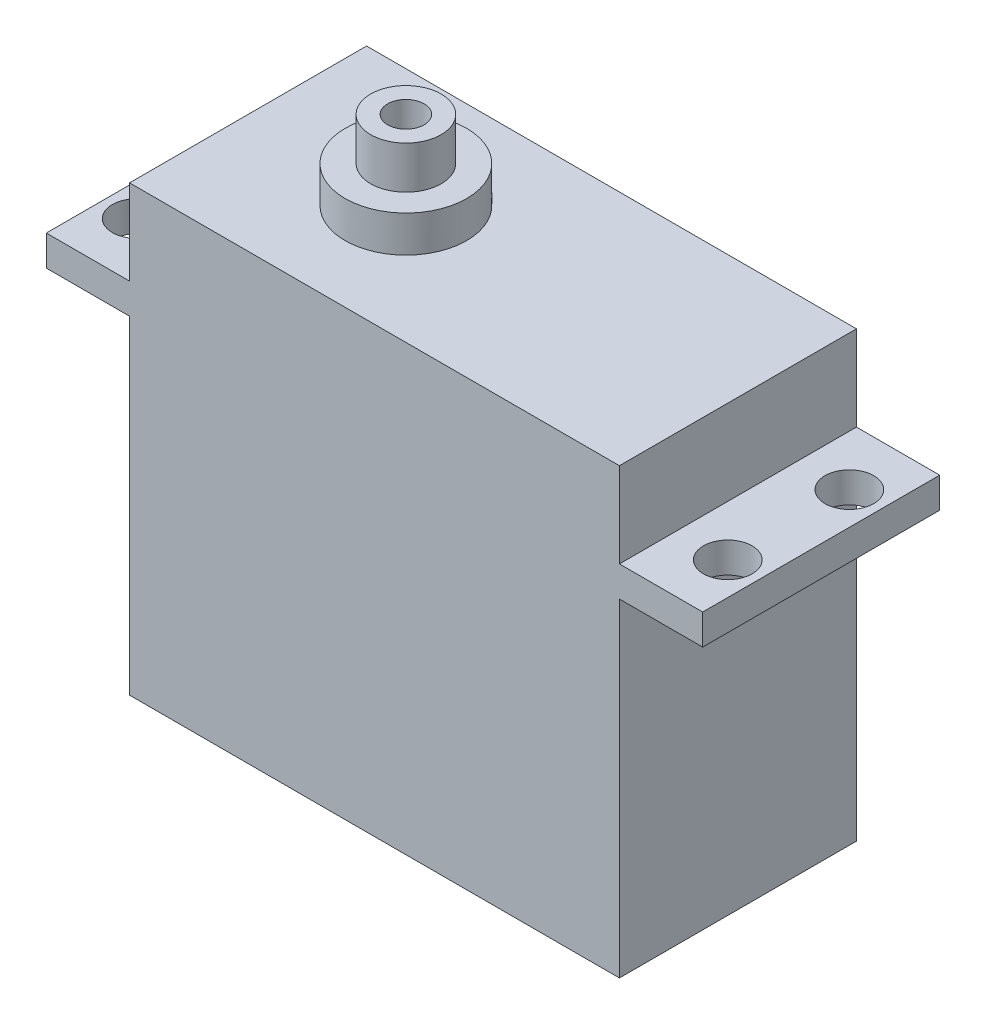
ISO-10303-21;
HEADER;
FILE_DESCRIPTION(('STEP AP214'),'2;1');
FILE_NAME('part.step','',(''),(''),'','','');
FILE_SCHEMA(('AUTOMOTIVE_DESIGN { 1 0 10303 214 1 1 1 1 }'));
ENDSEC;
DATA;
#1=APPLICATION_CONTEXT('core data for automotive mechanical design processes');
#2=APPLICATION_PROTOCOL_DEFINITION('international standard','automotive_design',2000,#1);
#3=PRODUCT_CONTEXT('',#1,'mechanical');
#4=PRODUCT('Part','Part','',(#3));
#5=PRODUCT_RELATED_PRODUCT_CATEGORY('part','',(#4));
#6=PRODUCT_DEFINITION_FORMATION('','',#4);
#7=PRODUCT_DEFINITION_CONTEXT('part definition',#1,'design');
#8=PRODUCT_DEFINITION('design','',#6,#7);
#9=PRODUCT_DEFINITION_SHAPE('','',#8);
#10=(LENGTH_UNIT() NAMED_UNIT(*) SI_UNIT(.MILLI.,.METRE.));
#11=(NAMED_UNIT(*) PLANE_ANGLE_UNIT() SI_UNIT($,.RADIAN.));
#12=(NAMED_UNIT(*) SI_UNIT($,.STERADIAN.) SOLID_ANGLE_UNIT());
#13=UNCERTAINTY_MEASURE_WITH_UNIT(LENGTH_MEASURE(1.E-05),#10,'distance_accuracy_value','');
#14=(GEOMETRIC_REPRESENTATION_CONTEXT(3) GLOBAL_UNCERTAINTY_ASSIGNED_CONTEXT((#13)) GLOBAL_UNIT_ASSIGNED_CONTEXT((#10,
#11,#12)) REPRESENTATION_CONTEXT('',''));
#15=CARTESIAN_POINT('',(0.,0.,0.));
#16=DIRECTION('',(0.,0.,1.));
#17=DIRECTION('',(1.,0.,0.));
#18=AXIS2_PLACEMENT_3D('',#15,#16,#17);
#19=CARTESIAN_POINT('',(-20.15,27.,9.75));
#20=DIRECTION('',(1.,0.,0.));
#21=DIRECTION('',(0.,0.,-1.));
#22=AXIS2_PLACEMENT_3D('',#19,#20,#21);
#23=PLANE('',#22);
#24=DIRECTION('',(0.,0.,1.));
#25=VECTOR('',#24,1.);
#26=CARTESIAN_POINT('',(-20.15,0.,9.75));
#27=LINE('',#26,#25);
#28=CARTESIAN_POINT('',(-20.15,0.,-9.75));
#29=VERTEX_POINT('',#28);
#30=CARTESIAN_POINT('',(-20.15,0.,9.75));
#31=VERTEX_POINT('',#30);
#32=EDGE_CURVE('E297',#29,#31,#27,.T.);
#33=ORIENTED_EDGE('',*,*,#32,.T.);
#34=DIRECTION('',(0.,-1.,0.));
#35=VECTOR('',#34,1.);
#36=CARTESIAN_POINT('',(-20.15,27.,9.75));
#37=LINE('',#36,#35);
#38=CARTESIAN_POINT('',(-20.15,27.,9.75));
#39=VERTEX_POINT('',#38);
#40=EDGE_CURVE('E302',#39,#31,#37,.T.);
#41=ORIENTED_EDGE('',*,*,#40,.F.);
#42=DIRECTION('',(0.,0.,1.));
#43=VECTOR('',#42,1.);
#44=CARTESIAN_POINT('',(-20.15,27.,9.75));
#45=LINE('',#44,#43);
#46=CARTESIAN_POINT('',(-20.15,27.,-9.75));
#47=VERTEX_POINT('',#46);
#48=EDGE_CURVE('E288',#47,#39,#45,.T.);
#49=ORIENTED_EDGE('',*,*,#48,.F.);
#50=DIRECTION('',(0.,-1.,0.));
#51=VECTOR('',#50,1.);
#52=CARTESIAN_POINT('',(-20.15,27.,-9.75));
#53=LINE('',#52,#51);
#54=EDGE_CURVE('E305',#47,#29,#53,.T.);
#55=ORIENTED_EDGE('',*,*,#54,.T.);
#56=EDGE_LOOP('',(#33,#41,#49,#55));
#57=FACE_BOUND('',#56,.T.);
#58=DIRECTION('',(0.,1.,0.));
#59=VECTOR('',#58,1.);
#60=CARTESIAN_POINT('',(-20.15,1.91574050567464,3.49494019914812));
#61=LINE('',#60,#59);
#62=CARTESIAN_POINT('',(-20.15,1.91574050567464,3.49494019914812));
#63=VERTEX_POINT('',#62);
#64=CARTESIAN_POINT('',(-20.15,5.06433527968195,3.49494019914812));
#65=VERTEX_POINT('',#64);
#66=EDGE_CURVE('E176',#63,#65,#61,.T.);
#67=ORIENTED_EDGE('',*,*,#66,.F.);
#68=DIRECTION('',(0.,0.,1.));
#69=VECTOR('',#68,1.);
#70=CARTESIAN_POINT('',(-20.15,1.91574050567464,-3.49494019914812));
#71=LINE('',#70,#69);
#72=CARTESIAN_POINT('',(-20.15,1.91574050567464,-3.49494019914812));
#73=VERTEX_POINT('',#72);
#74=EDGE_CURVE('E173',#73,#63,#71,.T.);
#75=ORIENTED_EDGE('',*,*,#74,.F.);
#76=DIRECTION('',(0.,-1.,0.));
#77=VECTOR('',#76,1.);
#78=CARTESIAN_POINT('',(-20.15,1.91574050567464,-3.49494019914812));
#79=LINE('',#78,#77);
#80=CARTESIAN_POINT('',(-20.15,5.06433527968195,-3.49494019914812));
#81=VERTEX_POINT('',#80);
#82=EDGE_CURVE('E63',#81,#73,#79,.T.);
#83=ORIENTED_EDGE('',*,*,#82,.F.);
#84=DIRECTION('',(0.,0.,-1.));
#85=VECTOR('',#84,1.);
#86=CARTESIAN_POINT('',(-20.15,5.06433527968195,-3.49494019914812));
#87=LINE('',#86,#85);
#88=EDGE_CURVE('E58',#65,#81,#87,.T.);
#89=ORIENTED_EDGE('',*,*,#88,.F.);
#90=EDGE_LOOP('',(#67,#75,#83,#89));
#91=FACE_BOUND('',#90,.T.);
#92=ADVANCED_FACE('F43',(#57,#91),#23,.F.);
#93=CARTESIAN_POINT('',(0.,36.5,0.));
#94=DIRECTION('',(0.,-1.,0.));
#95=DIRECTION('',(0.,0.,-1.));
#96=AXIS2_PLACEMENT_3D('',#93,#94,#95);
#97=PLANE('',#96);
#98=DIRECTION('',(0.,0.,-1.));
#99=VECTOR('',#98,1.);
#100=CARTESIAN_POINT('',(20.15,36.5,9.75));
#101=LINE('',#100,#99);
#102=CARTESIAN_POINT('',(20.15,36.5,9.75));
#103=VERTEX_POINT('',#102);
#104=CARTESIAN_POINT('',(20.15,36.5,-9.75));
#105=VERTEX_POINT('',#104);
#106=EDGE_CURVE('E198',#103,#105,#101,.T.);
#107=ORIENTED_EDGE('',*,*,#106,.T.);
#108=DIRECTION('',(-1.,0.,0.));
#109=VECTOR('',#108,1.);
#110=CARTESIAN_POINT('',(-20.15,36.5,-9.75));
#111=LINE('',#110,#109);
#112=CARTESIAN_POINT('',(-20.15,36.5,-9.75));
#113=VERTEX_POINT('',#112);
#114=EDGE_CURVE('E201',#105,#113,#111,.T.);
#115=ORIENTED_EDGE('',*,*,#114,.T.);
#116=DIRECTION('',(0.,0.,1.));
#117=VECTOR('',#116,1.);
#118=CARTESIAN_POINT('',(-20.15,36.5,9.75));
#119=LINE('',#118,#117);
#120=CARTESIAN_POINT('',(-20.15,36.5,9.75));
#121=VERTEX_POINT('',#120);
#122=EDGE_CURVE('E204',#113,#121,#119,.T.);
#123=ORIENTED_EDGE('',*,*,#122,.T.);
#124=DIRECTION('',(1.,0.,0.));
#125=VECTOR('',#124,1.);
#126=CARTESIAN_POINT('',(-20.15,36.5,9.75));
#127=LINE('',#126,#125);
#128=EDGE_CURVE('E206',#121,#103,#127,.T.);
#129=ORIENTED_EDGE('',*,*,#128,.T.);
#130=EDGE_LOOP('',(#107,#115,#123,#129));
#131=FACE_BOUND('',#130,.T.);
#132=CARTESIAN_POINT('',(-7.165,36.5,0.));
#133=DIRECTION('',(0.,-1.,0.));
#134=DIRECTION('',(0.,0.,-1.));
#135=AXIS2_PLACEMENT_3D('',#132,#133,#134);
#136=CIRCLE('',#135,5.);
#137=CARTESIAN_POINT('',(-7.165,36.5,-5.));
#138=VERTEX_POINT('',#137);
#139=EDGE_CURVE('E11',#138,#138,#136,.F.);
#140=ORIENTED_EDGE('',*,*,#139,.F.);
#141=EDGE_LOOP('',(#140));
#142=FACE_BOUND('',#141,.T.);
#143=ADVANCED_FACE('F342',(#131,#142),#97,.F.);
#144=CARTESIAN_POINT('',(0.,29.5,0.));
#145=DIRECTION('',(0.,-1.,0.));
#146=DIRECTION('',(0.,0.,-1.));
#147=AXIS2_PLACEMENT_3D('',#144,#145,#146);
#148=PLANE('',#147);
#149=CARTESIAN_POINT('',(24.315,29.5,-5.));
#150=DIRECTION('',(0.,1.,0.));
#151=DIRECTION('',(0.,0.,1.));
#152=AXIS2_PLACEMENT_3D('',#149,#150,#151);
#153=CIRCLE('',#152,2.);
#154=CARTESIAN_POINT('',(24.315,29.5,-3.));
#155=VERTEX_POINT('',#154);
#156=EDGE_CURVE('E243',#155,#155,#153,.T.);
#157=ORIENTED_EDGE('',*,*,#156,.F.);
#158=EDGE_LOOP('',(#157));
#159=FACE_BOUND('',#158,.T.);
#160=CARTESIAN_POINT('',(24.315,29.5,5.));
#161=DIRECTION('',(0.,1.,0.));
#162=DIRECTION('',(0.,0.,-1.));
#163=AXIS2_PLACEMENT_3D('',#160,#161,#162);
#164=CIRCLE('',#163,2.);
#165=CARTESIAN_POINT('',(24.315,29.5,3.));
#166=VERTEX_POINT('',#165);
#167=EDGE_CURVE('E238',#166,#166,#164,.T.);
#168=ORIENTED_EDGE('',*,*,#167,.F.);
#169=EDGE_LOOP('',(#168));
#170=FACE_BOUND('',#169,.T.);
#171=DIRECTION('',(0.,0.,-1.));
#172=VECTOR('',#171,1.);
#173=CARTESIAN_POINT('',(20.15,29.5,9.75));
#174=LINE('',#173,#172);
#175=CARTESIAN_POINT('',(20.15,29.5,9.75));
#176=VERTEX_POINT('',#175);
#177=CARTESIAN_POINT('',(20.15,29.5,-9.75));
#178=VERTEX_POINT('',#177);
#179=EDGE_CURVE('E197',#176,#178,#174,.T.);
#180=ORIENTED_EDGE('',*,*,#179,.F.);
#181=DIRECTION('',(1.,0.,0.));
#182=VECTOR('',#181,1.);
#183=CARTESIAN_POINT('',(-27.,29.5,9.75));
#184=LINE('',#183,#182);
#185=CARTESIAN_POINT('',(27.,29.5,9.75));
#186=VERTEX_POINT('',#185);
#187=EDGE_CURVE('E258',#176,#186,#184,.T.);
#188=ORIENTED_EDGE('',*,*,#187,.T.);
#189=DIRECTION('',(0.,0.,-1.));
#190=VECTOR('',#189,1.);
#191=CARTESIAN_POINT('',(27.,29.5,9.75));
#192=LINE('',#191,#190);
#193=CARTESIAN_POINT('',(27.,29.5,-9.75));
#194=VERTEX_POINT('',#193);
#195=EDGE_CURVE('E249',#186,#194,#192,.T.);
#196=ORIENTED_EDGE('',*,*,#195,.T.);
#197=DIRECTION('',(-1.,0.,0.));
#198=VECTOR('',#197,1.);
#199=CARTESIAN_POINT('',(-27.,29.5,-9.75));
#200=LINE('',#199,#198);
#201=EDGE_CURVE('E254',#194,#178,#200,.T.);
#202=ORIENTED_EDGE('',*,*,#201,.T.);
#203=EDGE_LOOP('',(#180,#188,#196,#202));
#204=FACE_BOUND('',#203,.T.);
#205=ADVANCED_FACE('F351',(#159,#170,#204),#148,.F.);
#206=CARTESIAN_POINT('',(-24.315,29.5,5.));
#207=DIRECTION('',(0.,1.,0.));
#208=DIRECTION('',(0.,0.,1.));
#209=AXIS2_PLACEMENT_3D('',#206,#207,#208);
#210=CIRCLE('',#209,2.);
#211=CARTESIAN_POINT('',(-24.315,29.5,7.));
#212=VERTEX_POINT('',#211);
#213=EDGE_CURVE('E225',#212,#212,#210,.T.);
#214=ORIENTED_EDGE('',*,*,#213,.F.);
#215=EDGE_LOOP('',(#214));
#216=FACE_BOUND('',#215,.T.);
#217=CARTESIAN_POINT('',(-24.315,29.5,-5.));
#218=DIRECTION('',(0.,1.,0.));
#219=DIRECTION('',(0.,0.,-1.));
#220=AXIS2_PLACEMENT_3D('',#217,#218,#219);
#221=CIRCLE('',#220,2.);
#222=CARTESIAN_POINT('',(-24.315,29.5,-7.));
#223=VERTEX_POINT('',#222);
#224=EDGE_CURVE('E231',#223,#223,#221,.T.);
#225=ORIENTED_EDGE('',*,*,#224,.F.);
#226=EDGE_LOOP('',(#225));
#227=FACE_BOUND('',#226,.T.);
#228=DIRECTION('',(0.,0.,1.));
#229=VECTOR('',#228,1.);
#230=CARTESIAN_POINT('',(-20.15,29.5,9.75));
#231=LINE('',#230,#229);
#232=CARTESIAN_POINT('',(-20.15,29.5,-9.75));
#233=VERTEX_POINT('',#232);
#234=CARTESIAN_POINT('',(-20.15,29.5,9.75));
#235=VERTEX_POINT('',#234);
#236=EDGE_CURVE('E202',#233,#235,#231,.T.);
#237=ORIENTED_EDGE('',*,*,#236,.F.);
#238=CARTESIAN_POINT('',(-27.,29.5,-9.75));
#239=VERTEX_POINT('',#238);
#240=EDGE_CURVE('E252',#233,#239,#200,.T.);
#241=ORIENTED_EDGE('',*,*,#240,.T.);
#242=DIRECTION('',(0.,0.,1.));
#243=VECTOR('',#242,1.);
#244=CARTESIAN_POINT('',(-27.,29.5,9.75));
#245=LINE('',#244,#243);
#246=CARTESIAN_POINT('',(-27.,29.5,9.75));
#247=VERTEX_POINT('',#246);
#248=EDGE_CURVE('E256',#239,#247,#245,.T.);
#249=ORIENTED_EDGE('',*,*,#248,.T.);
#250=EDGE_CURVE('E259',#247,#235,#184,.T.);
#251=ORIENTED_EDGE('',*,*,#250,.T.);
#252=EDGE_LOOP('',(#237,#241,#249,#251));
#253=FACE_BOUND('',#252,.T.);
#254=ADVANCED_FACE('F334',(#216,#227,#253),#148,.F.);
#255=CARTESIAN_POINT('',(20.15,27.,9.75));
#256=DIRECTION('',(-1.,0.,0.));
#257=DIRECTION('',(0.,0.,1.));
#258=AXIS2_PLACEMENT_3D('',#255,#256,#257);
#259=PLANE('',#258);
#260=DIRECTION('',(0.,0.,-1.));
#261=VECTOR('',#260,1.);
#262=CARTESIAN_POINT('',(20.15,0.,9.75));
#263=LINE('',#262,#261);
#264=CARTESIAN_POINT('',(20.15,0.,9.75));
#265=VERTEX_POINT('',#264);
#266=CARTESIAN_POINT('',(20.15,0.,-9.75));
#267=VERTEX_POINT('',#266);
#268=EDGE_CURVE('E284',#265,#267,#263,.T.);
#269=ORIENTED_EDGE('',*,*,#268,.T.);
#270=DIRECTION('',(0.,-1.,0.));
#271=VECTOR('',#270,1.);
#272=CARTESIAN_POINT('',(20.15,27.,-9.75));
#273=LINE('',#272,#271);
#274=CARTESIAN_POINT('',(20.15,27.,-9.75));
#275=VERTEX_POINT('',#274);
#276=EDGE_CURVE('E51',#275,#267,#273,.T.);
#277=ORIENTED_EDGE('',*,*,#276,.F.);
#278=DIRECTION('',(0.,0.,-1.));
#279=VECTOR('',#278,1.);
#280=CARTESIAN_POINT('',(20.15,27.,9.75));
#281=LINE('',#280,#279);
#282=CARTESIAN_POINT('',(20.15,27.,9.75));
#283=VERTEX_POINT('',#282);
#284=EDGE_CURVE('E285',#283,#275,#281,.T.);
#285=ORIENTED_EDGE('',*,*,#284,.F.);
#286=DIRECTION('',(0.,-1.,0.));
#287=VECTOR('',#286,1.);
#288=CARTESIAN_POINT('',(20.15,27.,9.75));
#289=LINE('',#288,#287);
#290=EDGE_CURVE('E292',#283,#265,#289,.T.);
#291=ORIENTED_EDGE('',*,*,#290,.T.);
#292=EDGE_LOOP('',(#269,#277,#285,#291));
#293=FACE_BOUND('',#292,.T.);
#294=ADVANCED_FACE('F45',(#293),#259,.F.);
#295=CARTESIAN_POINT('',(-20.15,27.,-9.75));
#296=DIRECTION('',(0.,0.,1.));
#297=DIRECTION('',(1.,0.,0.));
#298=AXIS2_PLACEMENT_3D('',#295,#296,#297);
#299=PLANE('',#298);
#300=DIRECTION('',(-1.,0.,0.));
#301=VECTOR('',#300,1.);
#302=CARTESIAN_POINT('',(-20.15,0.,-9.75));
#303=LINE('',#302,#301);
#304=EDGE_CURVE('E295',#267,#29,#303,.T.);
#305=ORIENTED_EDGE('',*,*,#304,.T.);
#306=ORIENTED_EDGE('',*,*,#54,.F.);
#307=DIRECTION('',(-1.,0.,0.));
#308=VECTOR('',#307,1.);
#309=CARTESIAN_POINT('',(-27.,27.,-9.75));
#310=LINE('',#309,#308);
#311=CARTESIAN_POINT('',(-27.,27.,-9.75));
#312=VERTEX_POINT('',#311);
#313=EDGE_CURVE('E264',#47,#312,#310,.T.);
#314=ORIENTED_EDGE('',*,*,#313,.T.);
#315=DIRECTION('',(0.,-1.,0.));
#316=VECTOR('',#315,1.);
#317=CARTESIAN_POINT('',(-27.,29.5,-9.75));
#318=LINE('',#317,#316);
#319=EDGE_CURVE('E278',#239,#312,#318,.T.);
#320=ORIENTED_EDGE('',*,*,#319,.F.);
#321=ORIENTED_EDGE('',*,*,#240,.F.);
#322=DIRECTION('',(0.,-1.,0.));
#323=VECTOR('',#322,1.);
#324=CARTESIAN_POINT('',(-20.15,36.5,-9.75));
#325=LINE('',#324,#323);
#326=EDGE_CURVE('E218',#113,#233,#325,.T.);
#327=ORIENTED_EDGE('',*,*,#326,.F.);
#328=ORIENTED_EDGE('',*,*,#114,.F.);
#329=DIRECTION('',(0.,-1.,0.));
#330=VECTOR('',#329,1.);
#331=CARTESIAN_POINT('',(20.15,36.5,-9.75));
#332=LINE('',#331,#330);
#333=EDGE_CURVE('E221',#105,#178,#332,.T.);
#334=ORIENTED_EDGE('',*,*,#333,.T.);
#335=ORIENTED_EDGE('',*,*,#201,.F.);
#336=DIRECTION('',(0.,-1.,0.));
#337=VECTOR('',#336,1.);
#338=CARTESIAN_POINT('',(27.,29.5,-9.75));
#339=LINE('',#338,#337);
#340=CARTESIAN_POINT('',(27.,27.,-9.75));
#341=VERTEX_POINT('',#340);
#342=EDGE_CURVE('E281',#194,#341,#339,.T.);
#343=ORIENTED_EDGE('',*,*,#342,.T.);
#344=EDGE_CURVE('E265',#341,#275,#310,.T.);
#345=ORIENTED_EDGE('',*,*,#344,.T.);
#346=ORIENTED_EDGE('',*,*,#276,.T.);
#347=EDGE_LOOP('',(#305,#306,#314,#320,#321,#327,#328,#334,#335,#343,#345,#346));
#348=FACE_BOUND('',#347,.T.);
#349=ADVANCED_FACE('F309',(#348),#299,.F.);
#350=CARTESIAN_POINT('',(-20.15,27.,9.75));
#351=DIRECTION('',(0.,0.,-1.));
#352=DIRECTION('',(-1.,0.,0.));
#353=AXIS2_PLACEMENT_3D('',#350,#351,#352);
#354=PLANE('',#353);
#355=DIRECTION('',(1.,0.,0.));
#356=VECTOR('',#355,1.);
#357=CARTESIAN_POINT('',(-20.15,0.,9.75));
#358=LINE('',#357,#356);
#359=EDGE_CURVE('E289',#31,#265,#358,.T.);
#360=ORIENTED_EDGE('',*,*,#359,.T.);
#361=ORIENTED_EDGE('',*,*,#290,.F.);
#362=DIRECTION('',(1.,0.,0.));
#363=VECTOR('',#362,1.);
#364=CARTESIAN_POINT('',(-27.,27.,9.75));
#365=LINE('',#364,#363);
#366=CARTESIAN_POINT('',(27.,27.,9.75));
#367=VERTEX_POINT('',#366);
#368=EDGE_CURVE('E270',#283,#367,#365,.T.);
#369=ORIENTED_EDGE('',*,*,#368,.T.);
#370=DIRECTION('',(0.,-1.,0.));
#371=VECTOR('',#370,1.);
#372=CARTESIAN_POINT('',(27.,29.5,9.75));
#373=LINE('',#372,#371);
#374=EDGE_CURVE('E261',#186,#367,#373,.T.);
#375=ORIENTED_EDGE('',*,*,#374,.F.);
#376=ORIENTED_EDGE('',*,*,#187,.F.);
#377=DIRECTION('',(0.,-1.,0.));
#378=VECTOR('',#377,1.);
#379=CARTESIAN_POINT('',(20.15,36.5,9.75));
#380=LINE('',#379,#378);
#381=EDGE_CURVE('E208',#103,#176,#380,.T.);
#382=ORIENTED_EDGE('',*,*,#381,.F.);
#383=ORIENTED_EDGE('',*,*,#128,.F.);
#384=DIRECTION('',(0.,-1.,0.));
#385=VECTOR('',#384,1.);
#386=CARTESIAN_POINT('',(-20.15,36.5,9.75));
#387=LINE('',#386,#385);
#388=EDGE_CURVE('E215',#121,#235,#387,.T.);
#389=ORIENTED_EDGE('',*,*,#388,.T.);
#390=ORIENTED_EDGE('',*,*,#250,.F.);
#391=DIRECTION('',(0.,-1.,0.));
#392=VECTOR('',#391,1.);
#393=CARTESIAN_POINT('',(-27.,29.5,9.75));
#394=LINE('',#393,#392);
#395=CARTESIAN_POINT('',(-27.,27.,9.75));
#396=VERTEX_POINT('',#395);
#397=EDGE_CURVE('E275',#247,#396,#394,.T.);
#398=ORIENTED_EDGE('',*,*,#397,.T.);
#399=EDGE_CURVE('E253',#396,#39,#365,.T.);
#400=ORIENTED_EDGE('',*,*,#399,.T.);
#401=ORIENTED_EDGE('',*,*,#40,.T.);
#402=EDGE_LOOP('',(#360,#361,#369,#375,#376,#382,#383,#389,#390,#398,#400,#401));
#403=FACE_BOUND('',#402,.T.);
#404=ADVANCED_FACE('F320',(#403),#354,.F.);
#405=CARTESIAN_POINT('',(0.,0.,0.));
#406=DIRECTION('',(0.,-1.,0.));
#407=DIRECTION('',(0.,0.,-1.));
#408=AXIS2_PLACEMENT_3D('',#405,#406,#407);
#409=PLANE('',#408);
#410=ORIENTED_EDGE('',*,*,#268,.F.);
#411=ORIENTED_EDGE('',*,*,#359,.F.);
#412=ORIENTED_EDGE('',*,*,#32,.F.);
#413=ORIENTED_EDGE('',*,*,#304,.F.);
#414=EDGE_LOOP('',(#410,#411,#412,#413));
#415=FACE_BOUND('',#414,.T.);
#416=ADVANCED_FACE('F315',(#415),#409,.T.);
#417=CARTESIAN_POINT('',(0.,27.,0.));
#418=DIRECTION('',(0.,-1.,0.));
#419=DIRECTION('',(0.,0.,-1.));
#420=AXIS2_PLACEMENT_3D('',#417,#418,#419);
#421=PLANE('',#420);
#422=CARTESIAN_POINT('',(24.315,27.,5.));
#423=DIRECTION('',(0.,-1.,0.));
#424=DIRECTION('',(0.,0.,-1.));
#425=AXIS2_PLACEMENT_3D('',#422,#423,#424);
#426=CIRCLE('',#425,2.);
#427=CARTESIAN_POINT('',(24.315,27.,3.));
#428=VERTEX_POINT('',#427);
#429=EDGE_CURVE('E228',#428,#428,#426,.F.);
#430=ORIENTED_EDGE('',*,*,#429,.T.);
#431=EDGE_LOOP('',(#430));
#432=FACE_BOUND('',#431,.T.);
#433=CARTESIAN_POINT('',(24.315,27.,-5.));
#434=DIRECTION('',(0.,-1.,0.));
#435=DIRECTION('',(0.,0.,-1.));
#436=AXIS2_PLACEMENT_3D('',#433,#434,#435);
#437=CIRCLE('',#436,2.);
#438=CARTESIAN_POINT('',(24.315,27.,-7.));
#439=VERTEX_POINT('',#438);
#440=EDGE_CURVE('E234',#439,#439,#437,.F.);
#441=ORIENTED_EDGE('',*,*,#440,.T.);
#442=EDGE_LOOP('',(#441));
#443=FACE_BOUND('',#442,.T.);
#444=ORIENTED_EDGE('',*,*,#368,.F.);
#445=ORIENTED_EDGE('',*,*,#284,.T.);
#446=ORIENTED_EDGE('',*,*,#344,.F.);
#447=DIRECTION('',(0.,0.,-1.));
#448=VECTOR('',#447,1.);
#449=CARTESIAN_POINT('',(27.,27.,9.75));
#450=LINE('',#449,#448);
#451=EDGE_CURVE('E246',#367,#341,#450,.T.);
#452=ORIENTED_EDGE('',*,*,#451,.F.);
#453=EDGE_LOOP('',(#444,#445,#446,#452));
#454=FACE_BOUND('',#453,.T.);
#455=ADVANCED_FACE('F360',(#432,#443,#454),#421,.T.);
#456=CARTESIAN_POINT('',(27.,29.5,9.75));
#457=DIRECTION('',(-1.,0.,0.));
#458=DIRECTION('',(0.,0.,1.));
#459=AXIS2_PLACEMENT_3D('',#456,#457,#458);
#460=PLANE('',#459);
#461=ORIENTED_EDGE('',*,*,#451,.T.);
#462=ORIENTED_EDGE('',*,*,#342,.F.);
#463=ORIENTED_EDGE('',*,*,#195,.F.);
#464=ORIENTED_EDGE('',*,*,#374,.T.);
#465=EDGE_LOOP('',(#461,#462,#463,#464));
#466=FACE_BOUND('',#465,.T.);
#467=ADVANCED_FACE('F358',(#466),#460,.F.);
#468=CARTESIAN_POINT('',(-27.,29.5,9.75));
#469=DIRECTION('',(1.,0.,0.));
#470=DIRECTION('',(0.,0.,-1.));
#471=AXIS2_PLACEMENT_3D('',#468,#469,#470);
#472=PLANE('',#471);
#473=DIRECTION('',(0.,0.,1.));
#474=VECTOR('',#473,1.);
#475=CARTESIAN_POINT('',(-27.,27.,9.75));
#476=LINE('',#475,#474);
#477=EDGE_CURVE('E268',#312,#396,#476,.T.);
#478=ORIENTED_EDGE('',*,*,#477,.T.);
#479=ORIENTED_EDGE('',*,*,#397,.F.);
#480=ORIENTED_EDGE('',*,*,#248,.F.);
#481=ORIENTED_EDGE('',*,*,#319,.T.);
#482=EDGE_LOOP('',(#478,#479,#480,#481));
#483=FACE_BOUND('',#482,.T.);
#484=ADVANCED_FACE('F332',(#483),#472,.F.);
#485=CARTESIAN_POINT('',(-24.315,27.,-5.));
#486=DIRECTION('',(0.,-1.,0.));
#487=DIRECTION('',(0.,0.,-1.));
#488=AXIS2_PLACEMENT_3D('',#485,#486,#487);
#489=CIRCLE('',#488,2.);
#490=CARTESIAN_POINT('',(-24.315,27.,-7.));
#491=VERTEX_POINT('',#490);
#492=EDGE_CURVE('E235',#491,#491,#489,.F.);
#493=ORIENTED_EDGE('',*,*,#492,.T.);
#494=EDGE_LOOP('',(#493));
#495=FACE_BOUND('',#494,.T.);
#496=CARTESIAN_POINT('',(-24.315,27.,5.));
#497=DIRECTION('',(0.,-1.,0.));
#498=DIRECTION('',(0.,0.,-1.));
#499=AXIS2_PLACEMENT_3D('',#496,#497,#498);
#500=CIRCLE('',#499,2.);
#501=CARTESIAN_POINT('',(-24.315,27.,3.));
#502=VERTEX_POINT('',#501);
#503=EDGE_CURVE('E224',#502,#502,#500,.F.);
#504=ORIENTED_EDGE('',*,*,#503,.T.);
#505=EDGE_LOOP('',(#504));
#506=FACE_BOUND('',#505,.T.);
#507=ORIENTED_EDGE('',*,*,#313,.F.);
#508=ORIENTED_EDGE('',*,*,#48,.T.);
#509=ORIENTED_EDGE('',*,*,#399,.F.);
#510=ORIENTED_EDGE('',*,*,#477,.F.);
#511=EDGE_LOOP('',(#507,#508,#509,#510));
#512=FACE_BOUND('',#511,.T.);
#513=ADVANCED_FACE('F327',(#495,#506,#512),#421,.T.);
#514=CARTESIAN_POINT('',(-24.315,-0.001000000000001,5.));
#515=DIRECTION('',(0.,1.,0.));
#516=DIRECTION('',(0.,0.,1.));
#517=AXIS2_PLACEMENT_3D('',#514,#515,#516);
#518=CYLINDRICAL_SURFACE('',#517,2.);
#519=ORIENTED_EDGE('',*,*,#503,.F.);
#520=EDGE_LOOP('',(#519));
#521=FACE_BOUND('',#520,.T.);
#522=ORIENTED_EDGE('',*,*,#213,.T.);
#523=EDGE_LOOP('',(#522));
#524=FACE_BOUND('',#523,.T.);
#525=ADVANCED_FACE('F375',(#521,#524),#518,.F.);
#526=CARTESIAN_POINT('',(-24.315,-0.001000000000001,-5.));
#527=DIRECTION('',(0.,1.,0.));
#528=DIRECTION('',(0.,0.,1.));
#529=AXIS2_PLACEMENT_3D('',#526,#527,#528);
#530=CYLINDRICAL_SURFACE('',#529,2.);
#531=ORIENTED_EDGE('',*,*,#492,.F.);
#532=EDGE_LOOP('',(#531));
#533=FACE_BOUND('',#532,.T.);
#534=ORIENTED_EDGE('',*,*,#224,.T.);
#535=EDGE_LOOP('',(#534));
#536=FACE_BOUND('',#535,.T.);
#537=ADVANCED_FACE('F407',(#533,#536),#530,.F.);
#538=CARTESIAN_POINT('',(24.315,-0.001000000000001,-5.));
#539=DIRECTION('',(0.,1.,0.));
#540=DIRECTION('',(0.,0.,1.));
#541=AXIS2_PLACEMENT_3D('',#538,#539,#540);
#542=CYLINDRICAL_SURFACE('',#541,2.);
#543=ORIENTED_EDGE('',*,*,#440,.F.);
#544=EDGE_LOOP('',(#543));
#545=FACE_BOUND('',#544,.T.);
#546=ORIENTED_EDGE('',*,*,#156,.T.);
#547=EDGE_LOOP('',(#546));
#548=FACE_BOUND('',#547,.T.);
#549=ADVANCED_FACE('F403',(#545,#548),#542,.F.);
#550=CARTESIAN_POINT('',(24.315,-0.001000000000001,5.));
#551=DIRECTION('',(0.,1.,0.));
#552=DIRECTION('',(0.,0.,1.));
#553=AXIS2_PLACEMENT_3D('',#550,#551,#552);
#554=CYLINDRICAL_SURFACE('',#553,2.);
#555=ORIENTED_EDGE('',*,*,#429,.F.);
#556=EDGE_LOOP('',(#555));
#557=FACE_BOUND('',#556,.T.);
#558=ORIENTED_EDGE('',*,*,#167,.T.);
#559=EDGE_LOOP('',(#558));
#560=FACE_BOUND('',#559,.T.);
#561=ADVANCED_FACE('F406',(#557,#560),#554,.F.);
#562=CARTESIAN_POINT('',(20.15,36.5,9.75));
#563=DIRECTION('',(-1.,0.,0.));
#564=DIRECTION('',(0.,0.,1.));
#565=AXIS2_PLACEMENT_3D('',#562,#563,#564);
#566=PLANE('',#565);
#567=ORIENTED_EDGE('',*,*,#179,.T.);
#568=ORIENTED_EDGE('',*,*,#333,.F.);
#569=ORIENTED_EDGE('',*,*,#106,.F.);
#570=ORIENTED_EDGE('',*,*,#381,.T.);
#571=EDGE_LOOP('',(#567,#568,#569,#570));
#572=FACE_BOUND('',#571,.T.);
#573=ADVANCED_FACE('F348',(#572),#566,.F.);
#574=CARTESIAN_POINT('',(-20.15,36.5,9.75));
#575=DIRECTION('',(1.,0.,0.));
#576=DIRECTION('',(0.,0.,-1.));
#577=AXIS2_PLACEMENT_3D('',#574,#575,#576);
#578=PLANE('',#577);
#579=ORIENTED_EDGE('',*,*,#236,.T.);
#580=ORIENTED_EDGE('',*,*,#388,.F.);
#581=ORIENTED_EDGE('',*,*,#122,.F.);
#582=ORIENTED_EDGE('',*,*,#326,.T.);
#583=EDGE_LOOP('',(#579,#580,#581,#582));
#584=FACE_BOUND('',#583,.T.);
#585=ADVANCED_FACE('F338',(#584),#578,.F.);
#586=CARTESIAN_POINT('',(-7.165,39.5,0.));
#587=DIRECTION('',(0.,1.,0.));
#588=DIRECTION('',(0.,0.,1.));
#589=AXIS2_PLACEMENT_3D('',#586,#587,#588);
#590=PLANE('',#589);
#591=CARTESIAN_POINT('',(-7.165,39.5,0.));
#592=DIRECTION('',(0.,1.,0.));
#593=DIRECTION('',(0.,0.,1.));
#594=AXIS2_PLACEMENT_3D('',#591,#592,#593);
#595=CIRCLE('',#594,5.);
#596=CARTESIAN_POINT('',(-7.165,39.5,5.));
#597=VERTEX_POINT('',#596);
#598=EDGE_CURVE('E180',#597,#597,#595,.T.);
#599=ORIENTED_EDGE('',*,*,#598,.T.);
#600=EDGE_LOOP('',(#599));
#601=FACE_BOUND('',#600,.T.);
#602=CARTESIAN_POINT('',(-7.165,39.5,0.));
#603=DIRECTION('',(0.,1.,0.));
#604=DIRECTION('',(0.,0.,1.));
#605=AXIS2_PLACEMENT_3D('',#602,#603,#604);
#606=CIRCLE('',#605,2.9);
#607=CARTESIAN_POINT('',(-7.165,39.5,-2.9));
#608=VERTEX_POINT('',#607);
#609=EDGE_CURVE('E177',#608,#608,#606,.T.);
#610=ORIENTED_EDGE('',*,*,#609,.F.);
#611=EDGE_LOOP('',(#610));
#612=FACE_BOUND('',#611,.T.);
#613=ADVANCED_FACE('F421',(#601,#612),#590,.T.);
#614=CARTESIAN_POINT('',(-7.165,39.5,0.));
#615=DIRECTION('',(0.,-1.,0.));
#616=DIRECTION('',(0.,0.,-1.));
#617=AXIS2_PLACEMENT_3D('',#614,#615,#616);
#618=CYLINDRICAL_SURFACE('',#617,5.);
#619=ORIENTED_EDGE('',*,*,#598,.F.);
#620=EDGE_LOOP('',(#619));
#621=FACE_BOUND('',#620,.T.);
#622=ORIENTED_EDGE('',*,*,#139,.T.);
#623=EDGE_LOOP('',(#622));
#624=FACE_BOUND('',#623,.T.);
#625=ADVANCED_FACE('F434',(#621,#624),#618,.T.);
#626=CARTESIAN_POINT('',(-7.165,36.5,0.));
#627=DIRECTION('',(0.,1.,0.));
#628=DIRECTION('',(0.,0.,1.));
#629=AXIS2_PLACEMENT_3D('',#626,#627,#628);
#630=CIRCLE('',#629,1.5);
#631=CARTESIAN_POINT('',(-7.165,36.5,-1.5));
#632=VERTEX_POINT('',#631);
#633=EDGE_CURVE('E188',#632,#632,#630,.T.);
#634=ORIENTED_EDGE('',*,*,#633,.T.);
#635=EDGE_LOOP('',(#634));
#636=FACE_BOUND('',#635,.T.);
#637=ADVANCED_FACE('F385',(#636),#97,.F.);
#638=CARTESIAN_POINT('',(-7.165,43.,0.));
#639=DIRECTION('',(0.,-1.,0.));
#640=DIRECTION('',(0.,0.,-1.));
#641=AXIS2_PLACEMENT_3D('',#638,#639,#640);
#642=CYLINDRICAL_SURFACE('',#641,1.5);
#643=CARTESIAN_POINT('',(-7.165,43.,0.));
#644=DIRECTION('',(0.,1.,0.));
#645=DIRECTION('',(0.,0.,1.));
#646=AXIS2_PLACEMENT_3D('',#643,#644,#645);
#647=CIRCLE('',#646,1.5);
#648=CARTESIAN_POINT('',(-7.165,43.,-1.5));
#649=VERTEX_POINT('',#648);
#650=EDGE_CURVE('E189',#649,#649,#647,.T.);
#651=CARTESIAN_POINT('',(-7.165,43.,-1.5));
#652=CARTESIAN_POINT('',(-7.165,42.9322916666667,-1.5));
#653=CARTESIAN_POINT('',(-7.165,42.8645833333333,-1.5));
#654=CARTESIAN_POINT('',(-7.165,42.7291666666667,-1.5));
#655=CARTESIAN_POINT('',(-7.165,42.6614583333333,-1.5));
#656=CARTESIAN_POINT('',(-7.165,42.5260416666667,-1.5));
#657=CARTESIAN_POINT('',(-7.165,42.4583333333333,-1.5));
#658=CARTESIAN_POINT('',(-7.165,42.3229166666667,-1.5));
#659=CARTESIAN_POINT('',(-7.165,42.2552083333333,-1.5));
#660=CARTESIAN_POINT('',(-7.165,42.1197916666667,-1.5));
#661=CARTESIAN_POINT('',(-7.165,42.0520833333333,-1.5));
#662=CARTESIAN_POINT('',(-7.165,41.9166666666667,-1.5));
#663=CARTESIAN_POINT('',(-7.165,41.8489583333333,-1.5));
#664=CARTESIAN_POINT('',(-7.165,41.7135416666667,-1.5));
#665=CARTESIAN_POINT('',(-7.165,41.6458333333333,-1.5));
#666=CARTESIAN_POINT('',(-7.165,41.5104166666667,-1.5));
#667=CARTESIAN_POINT('',(-7.165,41.4427083333333,-1.5));
#668=CARTESIAN_POINT('',(-7.165,41.3072916666667,-1.5));
#669=CARTESIAN_POINT('',(-7.165,41.2395833333333,-1.5));
#670=CARTESIAN_POINT('',(-7.165,41.1041666666667,-1.5));
#671=CARTESIAN_POINT('',(-7.165,41.0364583333333,-1.5));
#672=CARTESIAN_POINT('',(-7.165,40.9010416666667,-1.5));
#673=CARTESIAN_POINT('',(-7.165,40.8333333333333,-1.5));
#674=CARTESIAN_POINT('',(-7.165,40.6979166666667,-1.5));
#675=CARTESIAN_POINT('',(-7.165,40.6302083333333,-1.5));
#676=CARTESIAN_POINT('',(-7.165,40.4947916666667,-1.5));
#677=CARTESIAN_POINT('',(-7.165,40.4270833333333,-1.5));
#678=CARTESIAN_POINT('',(-7.165,40.2916666666667,-1.5));
#679=CARTESIAN_POINT('',(-7.165,40.2239583333333,-1.5));
#680=CARTESIAN_POINT('',(-7.165,40.0885416666667,-1.5));
#681=CARTESIAN_POINT('',(-7.165,40.0208333333333,-1.5));
#682=CARTESIAN_POINT('',(-7.165,39.8854166666667,-1.5));
#683=CARTESIAN_POINT('',(-7.165,39.8177083333333,-1.5));
#684=CARTESIAN_POINT('',(-7.165,39.6822916666667,-1.5));
#685=CARTESIAN_POINT('',(-7.165,39.6145833333333,-1.5));
#686=CARTESIAN_POINT('',(-7.165,39.4791666666667,-1.5));
#687=CARTESIAN_POINT('',(-7.165,39.4114583333333,-1.5));
#688=CARTESIAN_POINT('',(-7.165,39.2760416666667,-1.5));
#689=CARTESIAN_POINT('',(-7.165,39.2083333333333,-1.5));
#690=CARTESIAN_POINT('',(-7.165,39.0729166666667,-1.5));
#691=CARTESIAN_POINT('',(-7.165,39.0052083333333,-1.5));
#692=CARTESIAN_POINT('',(-7.165,38.8697916666667,-1.5));
#693=CARTESIAN_POINT('',(-7.165,38.8020833333333,-1.5));
#694=CARTESIAN_POINT('',(-7.165,38.6666666666667,-1.5));
#695=CARTESIAN_POINT('',(-7.165,38.5989583333333,-1.5));
#696=CARTESIAN_POINT('',(-7.165,38.4635416666667,-1.5));
#697=CARTESIAN_POINT('',(-7.165,38.3958333333333,-1.5));
#698=CARTESIAN_POINT('',(-7.165,38.2604166666667,-1.5));
#699=CARTESIAN_POINT('',(-7.165,38.1927083333333,-1.5));
#700=CARTESIAN_POINT('',(-7.165,38.0572916666667,-1.5));
#701=CARTESIAN_POINT('',(-7.165,37.9895833333333,-1.5));
#702=CARTESIAN_POINT('',(-7.165,37.8541666666667,-1.5));
#703=CARTESIAN_POINT('',(-7.165,37.7864583333333,-1.5));
#704=CARTESIAN_POINT('',(-7.165,37.6510416666667,-1.5));
#705=CARTESIAN_POINT('',(-7.165,37.5833333333333,-1.5));
#706=CARTESIAN_POINT('',(-7.165,37.4479166666667,-1.5));
#707=CARTESIAN_POINT('',(-7.165,37.3802083333333,-1.5));
#708=CARTESIAN_POINT('',(-7.165,37.2447916666667,-1.5));
#709=CARTESIAN_POINT('',(-7.165,37.1770833333333,-1.5));
#710=CARTESIAN_POINT('',(-7.165,37.0416666666667,-1.5));
#711=CARTESIAN_POINT('',(-7.165,36.9739583333333,-1.5));
#712=CARTESIAN_POINT('',(-7.165,36.8385416666667,-1.5));
#713=CARTESIAN_POINT('',(-7.165,36.7708333333333,-1.5));
#714=CARTESIAN_POINT('',(-7.165,36.6354166666667,-1.5));
#715=CARTESIAN_POINT('',(-7.165,36.5677083333333,-1.5));
#716=CARTESIAN_POINT('',(-7.165,36.5,-1.5));
#717=B_SPLINE_CURVE_WITH_KNOTS('',3,(#651,#652,#653,#654,#655,#656,#657,#658,#659,#660,#661,
#662,#663,#664,#665,#666,#667,#668,#669,#670,#671,#672,#673,#674,#675,#676,#677,#678,#679,#680,
#681,#682,#683,#684,#685,#686,#687,#688,#689,#690,#691,#692,#693,#694,#695,#696,#697,#698,#699,
#700,#701,#702,#703,#704,#705,#706,#707,#708,#709,#710,#711,#712,#713,#714,#715,#716),
.UNSPECIFIED.,.F.,.F.,(4,2,2,2,2,2,2,2,2,2,2,2,2,2,2,2,2,2,2,2,2,2,2,2,2,2,2,2,2,2,2,2,4),(0.,
0.203125000000005,0.406250000000004,0.609375000000002,0.812500000000001,1.01562500000001,
1.21875,1.421875,1.625,1.828125,2.03125000000001,2.234375,2.4375,2.640625,2.84375000000001,
3.046875,3.25,3.453125,3.65625,3.85937500000001,4.0625,4.265625,4.46875,4.671875,4.875,5.078125,
5.28125,5.484375,5.6875,5.890625,6.09375,6.296875,6.5),.UNSPECIFIED.);
#718=EDGE_CURVE('BSEAM429',#649,#632,#717,.T.);
#719=ORIENTED_EDGE('',*,*,#650,.T.);
#720=ORIENTED_EDGE('',*,*,#633,.F.);
#721=ORIENTED_EDGE('',*,*,#718,.T.);
#722=ORIENTED_EDGE('',*,*,#718,.F.);
#723=EDGE_LOOP('',(#719,#721,#720,#722));
#724=FACE_BOUND('',#723,.T.);
#725=ADVANCED_FACE('F429',(#724),#642,.F.);
#726=CARTESIAN_POINT('',(-7.165,43.,0.));
#727=DIRECTION('',(0.,1.,0.));
#728=DIRECTION('',(0.,0.,1.));
#729=AXIS2_PLACEMENT_3D('',#726,#727,#728);
#730=PLANE('',#729);
#731=CARTESIAN_POINT('',(-7.165,43.,0.));
#732=DIRECTION('',(0.,1.,0.));
#733=DIRECTION('',(0.,0.,1.));
#734=AXIS2_PLACEMENT_3D('',#731,#732,#733);
#735=CIRCLE('',#734,2.9);
#736=CARTESIAN_POINT('',(-7.165,43.,-2.9));
#737=VERTEX_POINT('',#736);
#738=EDGE_CURVE('E192',#737,#737,#735,.T.);
#739=ORIENTED_EDGE('',*,*,#738,.T.);
#740=EDGE_LOOP('',(#739));
#741=FACE_BOUND('',#740,.T.);
#742=ORIENTED_EDGE('',*,*,#650,.F.);
#743=EDGE_LOOP('',(#742));
#744=FACE_BOUND('',#743,.T.);
#745=ADVANCED_FACE('F425',(#741,#744),#730,.T.);
#746=CARTESIAN_POINT('',(-7.165,43.,0.));
#747=DIRECTION('',(0.,-1.,0.));
#748=DIRECTION('',(0.,0.,-1.));
#749=AXIS2_PLACEMENT_3D('',#746,#747,#748);
#750=CYLINDRICAL_SURFACE('',#749,2.9);
#751=CARTESIAN_POINT('',(-7.165,39.5,-2.9));
#752=CARTESIAN_POINT('',(-7.165,39.5364583333333,-2.9));
#753=CARTESIAN_POINT('',(-7.165,39.5729166666667,-2.9));
#754=CARTESIAN_POINT('',(-7.165,39.6458333333333,-2.9));
#755=CARTESIAN_POINT('',(-7.165,39.6822916666667,-2.9));
#756=CARTESIAN_POINT('',(-7.165,39.7552083333333,-2.9));
#757=CARTESIAN_POINT('',(-7.165,39.7916666666667,-2.9));
#758=CARTESIAN_POINT('',(-7.165,39.8645833333333,-2.9));
#759=CARTESIAN_POINT('',(-7.165,39.9010416666667,-2.9));
#760=CARTESIAN_POINT('',(-7.165,39.9739583333333,-2.9));
#761=CARTESIAN_POINT('',(-7.165,40.0104166666667,-2.9));
#762=CARTESIAN_POINT('',(-7.165,40.0833333333333,-2.9));
#763=CARTESIAN_POINT('',(-7.165,40.1197916666667,-2.9));
#764=CARTESIAN_POINT('',(-7.165,40.1927083333333,-2.9));
#765=CARTESIAN_POINT('',(-7.165,40.2291666666667,-2.9));
#766=CARTESIAN_POINT('',(-7.165,40.3020833333333,-2.9));
#767=CARTESIAN_POINT('',(-7.165,40.3385416666667,-2.9));
#768=CARTESIAN_POINT('',(-7.165,40.4114583333333,-2.9));
#769=CARTESIAN_POINT('',(-7.165,40.4479166666667,-2.9));
#770=CARTESIAN_POINT('',(-7.165,40.5208333333333,-2.9));
#771=CARTESIAN_POINT('',(-7.165,40.5572916666667,-2.9));
#772=CARTESIAN_POINT('',(-7.165,40.6302083333333,-2.9));
#773=CARTESIAN_POINT('',(-7.165,40.6666666666667,-2.9));
#774=CARTESIAN_POINT('',(-7.165,40.7395833333333,-2.9));
#775=CARTESIAN_POINT('',(-7.165,40.7760416666667,-2.9));
#776=CARTESIAN_POINT('',(-7.165,40.8489583333333,-2.9));
#777=CARTESIAN_POINT('',(-7.165,40.8854166666667,-2.9));
#778=CARTESIAN_POINT('',(-7.165,40.9583333333333,-2.9));
#779=CARTESIAN_POINT('',(-7.165,40.9947916666667,-2.9));
#780=CARTESIAN_POINT('',(-7.165,41.0677083333333,-2.9));
#781=CARTESIAN_POINT('',(-7.165,41.1041666666667,-2.9));
#782=CARTESIAN_POINT('',(-7.165,41.1770833333333,-2.9));
#783=CARTESIAN_POINT('',(-7.165,41.2135416666667,-2.9));
#784=CARTESIAN_POINT('',(-7.165,41.2864583333333,-2.9));
#785=CARTESIAN_POINT('',(-7.165,41.3229166666667,-2.9));
#786=CARTESIAN_POINT('',(-7.165,41.3958333333333,-2.9));
#787=CARTESIAN_POINT('',(-7.165,41.4322916666667,-2.9));
#788=CARTESIAN_POINT('',(-7.165,41.5052083333333,-2.9));
#789=CARTESIAN_POINT('',(-7.165,41.5416666666667,-2.9));
#790=CARTESIAN_POINT('',(-7.165,41.6145833333333,-2.9));
#791=CARTESIAN_POINT('',(-7.165,41.6510416666667,-2.9));
#792=CARTESIAN_POINT('',(-7.165,41.7239583333333,-2.9));
#793=CARTESIAN_POINT('',(-7.165,41.7604166666667,-2.9));
#794=CARTESIAN_POINT('',(-7.165,41.8333333333333,-2.9));
#795=CARTESIAN_POINT('',(-7.165,41.8697916666667,-2.9));
#796=CARTESIAN_POINT('',(-7.165,41.9427083333333,-2.9));
#797=CARTESIAN_POINT('',(-7.165,41.9791666666667,-2.9));
#798=CARTESIAN_POINT('',(-7.165,42.0520833333333,-2.9));
#799=CARTESIAN_POINT('',(-7.165,42.0885416666667,-2.9));
#800=CARTESIAN_POINT('',(-7.165,42.1614583333333,-2.9));
#801=CARTESIAN_POINT('',(-7.165,42.1979166666667,-2.9));
#802=CARTESIAN_POINT('',(-7.165,42.2708333333333,-2.9));
#803=CARTESIAN_POINT('',(-7.165,42.3072916666667,-2.9));
#804=CARTESIAN_POINT('',(-7.165,42.3802083333333,-2.9));
#805=CARTESIAN_POINT('',(-7.165,42.4166666666667,-2.9));
#806=CARTESIAN_POINT('',(-7.165,42.4895833333333,-2.9));
#807=CARTESIAN_POINT('',(-7.165,42.5260416666667,-2.9));
#808=CARTESIAN_POINT('',(-7.165,42.5989583333333,-2.9));
#809=CARTESIAN_POINT('',(-7.165,42.6354166666667,-2.9));
#810=CARTESIAN_POINT('',(-7.165,42.7083333333333,-2.9));
#811=CARTESIAN_POINT('',(-7.165,42.7447916666667,-2.9));
#812=CARTESIAN_POINT('',(-7.165,42.8177083333333,-2.9));
#813=CARTESIAN_POINT('',(-7.165,42.8541666666667,-2.9));
#814=CARTESIAN_POINT('',(-7.165,42.9270833333333,-2.9));
#815=CARTESIAN_POINT('',(-7.165,42.9635416666667,-2.9));
#816=CARTESIAN_POINT('',(-7.165,43.,-2.9));
#817=B_SPLINE_CURVE_WITH_KNOTS('',3,(#751,#752,#753,#754,#755,#756,#757,#758,#759,#760,#761,
#762,#763,#764,#765,#766,#767,#768,#769,#770,#771,#772,#773,#774,#775,#776,#777,#778,#779,#780,
#781,#782,#783,#784,#785,#786,#787,#788,#789,#790,#791,#792,#793,#794,#795,#796,#797,#798,#799,
#800,#801,#802,#803,#804,#805,#806,#807,#808,#809,#810,#811,#812,#813,#814,#815,#816),
.UNSPECIFIED.,.F.,.F.,(4,2,2,2,2,2,2,2,2,2,2,2,2,2,2,2,2,2,2,2,2,2,2,2,2,2,2,2,2,2,2,2,4),(0.,
0.109374999999995,0.218749999999997,0.328124999999999,0.437499999999993,0.546874999999995,
0.656249999999997,0.765624999999999,0.874999999999994,0.984374999999996,1.09375,
1.20312499999999,1.31249999999999,1.421875,1.53125,1.64062499999999,1.74999999999999,1.859375,
1.96874999999999,2.07812499999999,2.1875,2.296875,2.40624999999999,2.51562499999999,2.625,
2.734375,2.84374999999999,2.95312499999999,3.0625,3.17187499999999,3.28124999999999,
3.39062499999999,3.5),.UNSPECIFIED.);
#818=EDGE_CURVE('BSEAM423',#608,#737,#817,.T.);
#819=ORIENTED_EDGE('',*,*,#609,.T.);
#820=ORIENTED_EDGE('',*,*,#738,.F.);
#821=ORIENTED_EDGE('',*,*,#818,.T.);
#822=ORIENTED_EDGE('',*,*,#818,.F.);
#823=EDGE_LOOP('',(#819,#821,#820,#822));
#824=FACE_BOUND('',#823,.T.);
#825=ADVANCED_FACE('F423',(#824),#750,.T.);
#826=CARTESIAN_POINT('',(-26.15,1.91574050567464,3.49494019914812));
#827=DIRECTION('',(0.,0.,-1.));
#828=DIRECTION('',(-1.,0.,0.));
#829=AXIS2_PLACEMENT_3D('',#826,#827,#828);
#830=PLANE('',#829);
#831=ORIENTED_EDGE('',*,*,#66,.T.);
#832=DIRECTION('',(1.,0.,0.));
#833=VECTOR('',#832,1.);
#834=CARTESIAN_POINT('',(-26.15,5.06433527968195,3.49494019914812));
#835=LINE('',#834,#833);
#836=CARTESIAN_POINT('',(-26.15,5.06433527968195,3.49494019914812));
#837=VERTEX_POINT('',#836);
#838=EDGE_CURVE('E157',#837,#65,#835,.T.);
#839=ORIENTED_EDGE('',*,*,#838,.F.);
#840=DIRECTION('',(0.,1.,0.));
#841=VECTOR('',#840,1.);
#842=CARTESIAN_POINT('',(-26.15,1.91574050567464,3.49494019914812));
#843=LINE('',#842,#841);
#844=CARTESIAN_POINT('',(-26.15,1.91574050567464,3.49494019914812));
#845=VERTEX_POINT('',#844);
#846=EDGE_CURVE('E164',#845,#837,#843,.T.);
#847=ORIENTED_EDGE('',*,*,#846,.F.);
#848=DIRECTION('',(1.,0.,0.));
#849=VECTOR('',#848,1.);
#850=CARTESIAN_POINT('',(-26.15,1.91574050567464,3.49494019914812));
#851=LINE('',#850,#849);
#852=EDGE_CURVE('E577',#845,#63,#851,.T.);
#853=ORIENTED_EDGE('',*,*,#852,.T.);
#854=EDGE_LOOP('',(#831,#839,#847,#853));
#855=FACE_BOUND('',#854,.T.);
#856=ADVANCED_FACE('F175',(#855),#830,.F.);
#857=CARTESIAN_POINT('',(-26.15,5.06433527968195,-3.49494019914812));
#858=DIRECTION('',(0.,-1.,0.));
#859=DIRECTION('',(0.,0.,-1.));
#860=AXIS2_PLACEMENT_3D('',#857,#858,#859);
#861=PLANE('',#860);
#862=ORIENTED_EDGE('',*,*,#88,.T.);
#863=DIRECTION('',(1.,0.,0.));
#864=VECTOR('',#863,1.);
#865=CARTESIAN_POINT('',(-26.15,5.06433527968195,-3.49494019914812));
#866=LINE('',#865,#864);
#867=CARTESIAN_POINT('',(-26.15,5.06433527968195,-3.49494019914812));
#868=VERTEX_POINT('',#867);
#869=EDGE_CURVE('E160',#868,#81,#866,.T.);
#870=ORIENTED_EDGE('',*,*,#869,.F.);
#871=DIRECTION('',(0.,0.,-1.));
#872=VECTOR('',#871,1.);
#873=CARTESIAN_POINT('',(-26.15,5.06433527968195,-3.49494019914812));
#874=LINE('',#873,#872);
#875=EDGE_CURVE('E153',#837,#868,#874,.T.);
#876=ORIENTED_EDGE('',*,*,#875,.F.);
#877=ORIENTED_EDGE('',*,*,#838,.T.);
#878=EDGE_LOOP('',(#862,#870,#876,#877));
#879=FACE_BOUND('',#878,.T.);
#880=ADVANCED_FACE('F155',(#879),#861,.F.);
#881=CARTESIAN_POINT('',(-26.15,1.91574050567464,-3.49494019914812));
#882=DIRECTION('',(0.,0.,1.));
#883=DIRECTION('',(1.,0.,0.));
#884=AXIS2_PLACEMENT_3D('',#881,#882,#883);
#885=PLANE('',#884);
#886=ORIENTED_EDGE('',*,*,#82,.T.);
#887=DIRECTION('',(1.,0.,0.));
#888=VECTOR('',#887,1.);
#889=CARTESIAN_POINT('',(-26.15,1.91574050567464,-3.49494019914812));
#890=LINE('',#889,#888);
#891=CARTESIAN_POINT('',(-26.15,1.91574050567464,-3.49494019914812));
#892=VERTEX_POINT('',#891);
#893=EDGE_CURVE('E182',#892,#73,#890,.T.);
#894=ORIENTED_EDGE('',*,*,#893,.F.);
#895=DIRECTION('',(0.,-1.,0.));
#896=VECTOR('',#895,1.);
#897=CARTESIAN_POINT('',(-26.15,1.91574050567464,-3.49494019914812));
#898=LINE('',#897,#896);
#899=EDGE_CURVE('E163',#868,#892,#898,.T.);
#900=ORIENTED_EDGE('',*,*,#899,.F.);
#901=ORIENTED_EDGE('',*,*,#869,.T.);
#902=EDGE_LOOP('',(#886,#894,#900,#901));
#903=FACE_BOUND('',#902,.T.);
#904=ADVANCED_FACE('F444',(#903),#885,.F.);
#905=CARTESIAN_POINT('',(-26.15,1.91574050567464,-3.49494019914812));
#906=DIRECTION('',(0.,1.,0.));
#907=DIRECTION('',(0.,0.,1.));
#908=AXIS2_PLACEMENT_3D('',#905,#906,#907);
#909=PLANE('',#908);
#910=ORIENTED_EDGE('',*,*,#74,.T.);
#911=ORIENTED_EDGE('',*,*,#852,.F.);
#912=DIRECTION('',(0.,0.,1.));
#913=VECTOR('',#912,1.);
#914=CARTESIAN_POINT('',(-26.15,1.91574050567464,-3.49494019914812));
#915=LINE('',#914,#913);
#916=EDGE_CURVE('E169',#892,#845,#915,.T.);
#917=ORIENTED_EDGE('',*,*,#916,.F.);
#918=ORIENTED_EDGE('',*,*,#893,.T.);
#919=EDGE_LOOP('',(#910,#911,#917,#918));
#920=FACE_BOUND('',#919,.T.);
#921=ADVANCED_FACE('F447',(#920),#909,.F.);
#922=CARTESIAN_POINT('',(-26.15,0.,0.));
#923=DIRECTION('',(1.,0.,0.));
#924=DIRECTION('',(0.,0.,-1.));
#925=AXIS2_PLACEMENT_3D('',#922,#923,#924);
#926=PLANE('',#925);
#927=ORIENTED_EDGE('',*,*,#846,.T.);
#928=ORIENTED_EDGE('',*,*,#875,.T.);
#929=ORIENTED_EDGE('',*,*,#899,.T.);
#930=ORIENTED_EDGE('',*,*,#916,.T.);
#931=EDGE_LOOP('',(#927,#928,#929,#930));
#932=FACE_BOUND('',#931,.T.);
#933=ADVANCED_FACE('F167',(#932),#926,.F.);
#934=CLOSED_SHELL('',(#92,#143,#205,#254,#294,#349,#404,#416,#455,#467,#484,#513,#525,#537,#549,
#561,#573,#585,#613,#625,#637,#725,#745,#825,#856,#880,#904,#921,#933));
#935=MANIFOLD_SOLID_BREP('B2',#934);
#936=ADVANCED_BREP_SHAPE_REPRESENTATION('',(#18,#935),#14);
#937=SHAPE_DEFINITION_REPRESENTATION(#9,#936);
ENDSEC;
END-ISO-10303-21;
